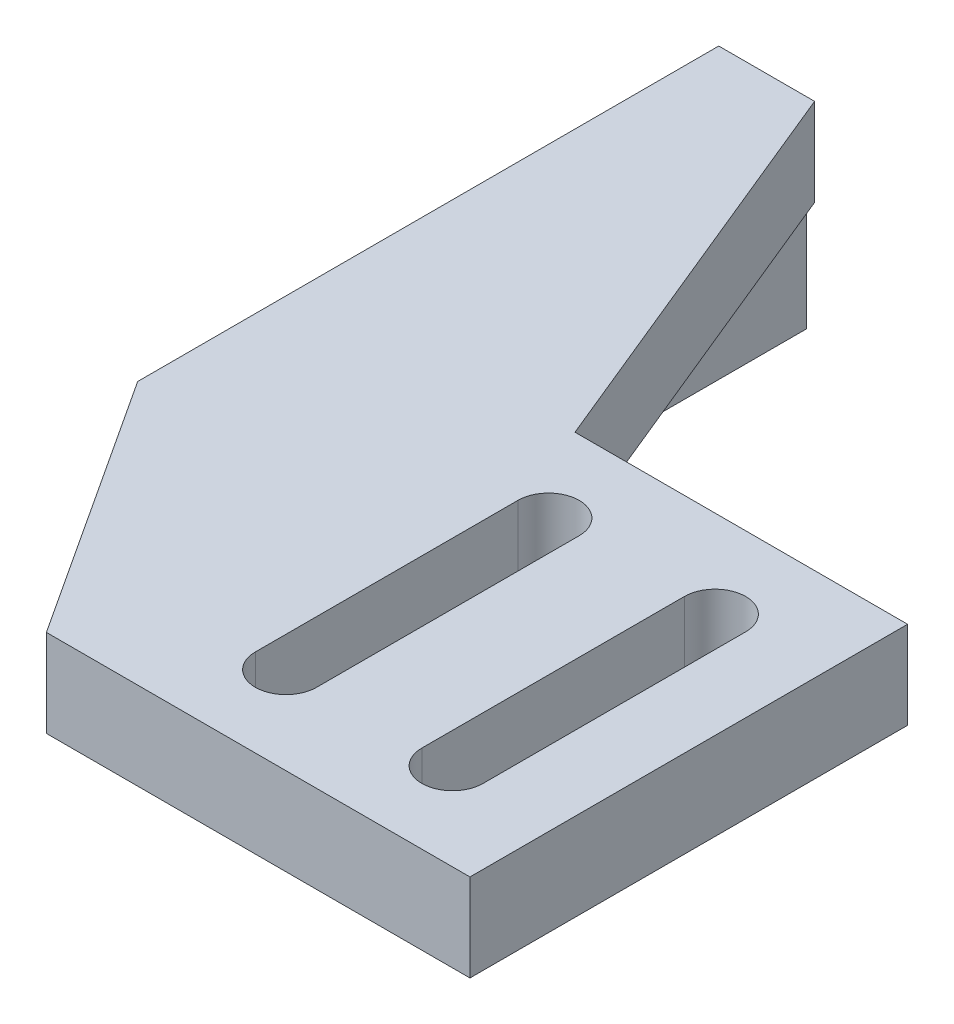
ISO-10303-21;
HEADER;
FILE_DESCRIPTION(('STEP AP214'),'2;1');
FILE_NAME('part.step','',(''),(''),'','','');
FILE_SCHEMA(('AUTOMOTIVE_DESIGN { 1 0 10303 214 1 1 1 1 }'));
ENDSEC;
DATA;
#1=APPLICATION_CONTEXT('core data for automotive mechanical design processes');
#2=APPLICATION_PROTOCOL_DEFINITION('international standard','automotive_design',2000,#1);
#3=PRODUCT_CONTEXT('',#1,'mechanical');
#4=PRODUCT('Part','Part','',(#3));
#5=PRODUCT_RELATED_PRODUCT_CATEGORY('part','',(#4));
#6=PRODUCT_DEFINITION_FORMATION('','',#4);
#7=PRODUCT_DEFINITION_CONTEXT('part definition',#1,'design');
#8=PRODUCT_DEFINITION('design','',#6,#7);
#9=PRODUCT_DEFINITION_SHAPE('','',#8);
#10=(LENGTH_UNIT() NAMED_UNIT(*) SI_UNIT(.MILLI.,.METRE.));
#11=(NAMED_UNIT(*) PLANE_ANGLE_UNIT() SI_UNIT($,.RADIAN.));
#12=(NAMED_UNIT(*) SI_UNIT($,.STERADIAN.) SOLID_ANGLE_UNIT());
#13=UNCERTAINTY_MEASURE_WITH_UNIT(LENGTH_MEASURE(1.E-05),#10,'distance_accuracy_value','');
#14=(GEOMETRIC_REPRESENTATION_CONTEXT(3) GLOBAL_UNCERTAINTY_ASSIGNED_CONTEXT((#13)) GLOBAL_UNIT_ASSIGNED_CONTEXT((#10,
#11,#12)) REPRESENTATION_CONTEXT('',''));
#15=CARTESIAN_POINT('',(0.,0.,0.));
#16=DIRECTION('',(0.,0.,1.));
#17=DIRECTION('',(1.,0.,0.));
#18=AXIS2_PLACEMENT_3D('',#15,#16,#17);
#19=CARTESIAN_POINT('',(-4.,33.5,16.));
#20=DIRECTION('',(-1.,0.,0.));
#21=DIRECTION('',(0.,0.,1.));
#22=AXIS2_PLACEMENT_3D('',#19,#20,#21);
#23=PLANE('',#22);
#24=CARTESIAN_POINT('',(-4.,36.5,-19.5));
#25=DIRECTION('',(-1.,0.,0.));
#26=DIRECTION('',(0.,0.,1.));
#27=AXIS2_PLACEMENT_3D('',#24,#25,#26);
#28=CIRCLE('',#27,1.75);
#29=CARTESIAN_POINT('',(-4.,36.5,-17.75));
#30=VERTEX_POINT('',#29);
#31=EDGE_CURVE('E175',#30,#30,#28,.T.);
#32=ORIENTED_EDGE('',*,*,#31,.T.);
#33=EDGE_LOOP('',(#32));
#34=FACE_BOUND('',#33,.T.);
#35=CARTESIAN_POINT('',(-4.,36.5,-9.5));
#36=DIRECTION('',(-1.,0.,0.));
#37=DIRECTION('',(0.,0.,1.));
#38=AXIS2_PLACEMENT_3D('',#35,#36,#37);
#39=CIRCLE('',#38,1.75);
#40=CARTESIAN_POINT('',(-4.,36.5,-7.74999999999999));
#41=VERTEX_POINT('',#40);
#42=EDGE_CURVE('E329',#41,#41,#39,.T.);
#43=ORIENTED_EDGE('',*,*,#42,.T.);
#44=EDGE_LOOP('',(#43));
#45=FACE_BOUND('',#44,.T.);
#46=DIRECTION('',(0.,1.,0.));
#47=VECTOR('',#46,1.);
#48=CARTESIAN_POINT('',(-4.,33.5,0.979024983401809));
#49=LINE('',#48,#47);
#50=CARTESIAN_POINT('',(-4.,33.5,0.979024983401809));
#51=VERTEX_POINT('',#50);
#52=CARTESIAN_POINT('',(-4.,40.,0.979024983401809));
#53=VERTEX_POINT('',#52);
#54=EDGE_CURVE('E162',#51,#53,#49,.T.);
#55=ORIENTED_EDGE('',*,*,#54,.F.);
#56=DIRECTION('',(0.,0.,1.));
#57=VECTOR('',#56,1.);
#58=CARTESIAN_POINT('',(-4.,33.5,16.));
#59=LINE('',#58,#57);
#60=CARTESIAN_POINT('',(-3.99999999999999,33.5,-32.2123511891126));
#61=VERTEX_POINT('',#60);
#62=EDGE_CURVE('E191',#61,#51,#59,.T.);
#63=ORIENTED_EDGE('',*,*,#62,.F.);
#64=DIRECTION('',(0.,1.,0.));
#65=VECTOR('',#64,1.);
#66=CARTESIAN_POINT('',(-3.99999999999999,33.5,-32.2123511891126));
#67=LINE('',#66,#65);
#68=CARTESIAN_POINT('',(-4.,40.,-32.2123511891126));
#69=VERTEX_POINT('',#68);
#70=EDGE_CURVE('E173',#61,#69,#67,.T.);
#71=ORIENTED_EDGE('',*,*,#70,.T.);
#72=DIRECTION('',(0.,0.,1.));
#73=VECTOR('',#72,1.);
#74=CARTESIAN_POINT('',(-4.,40.,16.));
#75=LINE('',#74,#73);
#76=EDGE_CURVE('E57',#69,#53,#75,.T.);
#77=ORIENTED_EDGE('',*,*,#76,.T.);
#78=EDGE_LOOP('',(#55,#63,#71,#77));
#79=FACE_BOUND('',#78,.T.);
#80=ADVANCED_FACE('F33',(#34,#45,#79),#23,.F.);
#81=CARTESIAN_POINT('',(0.,33.5,0.));
#82=DIRECTION('',(0.,-1.,0.));
#83=DIRECTION('',(0.,0.,-1.));
#84=AXIS2_PLACEMENT_3D('',#81,#82,#83);
#85=PLANE('',#84);
#86=ORIENTED_EDGE('',*,*,#62,.T.);
#87=DIRECTION('',(1.,0.,0.));
#88=VECTOR('',#87,1.);
#89=CARTESIAN_POINT('',(-4.,33.5,0.979024983401809));
#90=LINE('',#89,#88);
#91=CARTESIAN_POINT('',(-9.,33.5,0.979024983401809));
#92=VERTEX_POINT('',#91);
#93=EDGE_CURVE('E161',#92,#51,#90,.T.);
#94=ORIENTED_EDGE('',*,*,#93,.F.);
#95=DIRECTION('',(0.,0.,-1.));
#96=VECTOR('',#95,1.);
#97=CARTESIAN_POINT('',(-9.,33.5,16.));
#98=LINE('',#97,#96);
#99=CARTESIAN_POINT('',(-9.,33.5,-32.2123511891126));
#100=VERTEX_POINT('',#99);
#101=EDGE_CURVE('E174',#92,#100,#98,.T.);
#102=ORIENTED_EDGE('',*,*,#101,.T.);
#103=DIRECTION('',(1.,0.,0.));
#104=VECTOR('',#103,1.);
#105=CARTESIAN_POINT('',(-9.,33.5,-32.2123511891126));
#106=LINE('',#105,#104);
#107=EDGE_CURVE('E177',#100,#61,#106,.T.);
#108=ORIENTED_EDGE('',*,*,#107,.T.);
#109=EDGE_LOOP('',(#86,#94,#102,#108));
#110=FACE_BOUND('',#109,.T.);
#111=ADVANCED_FACE('F333',(#110),#85,.T.);
#112=CARTESIAN_POINT('',(0.805132442555695,24.,16.));
#113=DIRECTION('',(0.837384923606884,0.,-0.546613656722821));
#114=DIRECTION('',(-0.546613656722821,0.,-0.837384923606884));
#115=AXIS2_PLACEMENT_3D('',#112,#113,#114);
#116=PLANE('',#115);
#117=DIRECTION('',(0.,1.,0.));
#118=VECTOR('',#117,1.);
#119=CARTESIAN_POINT('',(-9.,24.,0.979024983401803));
#120=LINE('',#119,#118);
#121=CARTESIAN_POINT('',(-9.,40.,0.979024983401803));
#122=VERTEX_POINT('',#121);
#123=CARTESIAN_POINT('',(-9.,45.,0.979024983401803));
#124=VERTEX_POINT('',#123);
#125=EDGE_CURVE('E318',#122,#124,#120,.T.);
#126=ORIENTED_EDGE('',*,*,#125,.F.);
#127=DIRECTION('',(0.546613656722821,0.,0.837384923606884));
#128=VECTOR('',#127,1.);
#129=CARTESIAN_POINT('',(-6.759046816549,40.,4.41205375473065));
#130=LINE('',#129,#128);
#131=CARTESIAN_POINT('',(0.805132442555695,40.,16.));
#132=VERTEX_POINT('',#131);
#133=EDGE_CURVE('E51',#122,#132,#130,.T.);
#134=ORIENTED_EDGE('',*,*,#133,.T.);
#135=DIRECTION('',(0.,1.,0.));
#136=VECTOR('',#135,1.);
#137=CARTESIAN_POINT('',(0.805132442555695,24.,16.));
#138=LINE('',#137,#136);
#139=CARTESIAN_POINT('',(0.805132442555695,45.,16.));
#140=VERTEX_POINT('',#139);
#141=EDGE_CURVE('E301',#132,#140,#138,.T.);
#142=ORIENTED_EDGE('',*,*,#141,.T.);
#143=DIRECTION('',(-0.546613656722821,0.,-0.837384923606883));
#144=VECTOR('',#143,1.);
#145=CARTESIAN_POINT('',(0.805132442555695,45.,16.));
#146=LINE('',#145,#144);
#147=EDGE_CURVE('E314',#140,#124,#146,.T.);
#148=ORIENTED_EDGE('',*,*,#147,.T.);
#149=EDGE_LOOP('',(#126,#134,#142,#148));
#150=FACE_BOUND('',#149,.T.);
#151=ADVANCED_FACE('F337',(#150),#116,.F.);
#152=CARTESIAN_POINT('',(0.,45.,0.));
#153=DIRECTION('',(0.,-1.,0.));
#154=DIRECTION('',(0.,0.,-1.));
#155=AXIS2_PLACEMENT_3D('',#152,#153,#154);
#156=PLANE('',#155);
#157=CARTESIAN_POINT('',(19.,45.,11.));
#158=DIRECTION('',(0.,1.,0.));
#159=DIRECTION('',(0.,0.,1.));
#160=AXIS2_PLACEMENT_3D('',#157,#158,#159);
#161=CIRCLE('',#160,1.75);
#162=CARTESIAN_POINT('',(17.25,45.,11.));
#163=VERTEX_POINT('',#162);
#164=CARTESIAN_POINT('',(20.75,45.,11.));
#165=VERTEX_POINT('',#164);
#166=EDGE_CURVE('E225',#163,#165,#161,.T.);
#167=ORIENTED_EDGE('',*,*,#166,.F.);
#168=DIRECTION('',(0.,0.,1.));
#169=VECTOR('',#168,1.);
#170=CARTESIAN_POINT('',(17.25,45.,11.));
#171=LINE('',#170,#169);
#172=CARTESIAN_POINT('',(17.25,45.,-4.));
#173=VERTEX_POINT('',#172);
#174=EDGE_CURVE('E233',#173,#163,#171,.T.);
#175=ORIENTED_EDGE('',*,*,#174,.F.);
#176=CARTESIAN_POINT('',(19.,45.,-4.));
#177=DIRECTION('',(0.,1.,0.));
#178=DIRECTION('',(0.,0.,1.));
#179=AXIS2_PLACEMENT_3D('',#176,#177,#178);
#180=CIRCLE('',#179,1.75);
#181=CARTESIAN_POINT('',(20.75,45.,-4.));
#182=VERTEX_POINT('',#181);
#183=EDGE_CURVE('E230',#182,#173,#180,.T.);
#184=ORIENTED_EDGE('',*,*,#183,.F.);
#185=DIRECTION('',(0.,0.,-1.));
#186=VECTOR('',#185,1.);
#187=CARTESIAN_POINT('',(20.75,45.,11.));
#188=LINE('',#187,#186);
#189=EDGE_CURVE('E227',#165,#182,#188,.T.);
#190=ORIENTED_EDGE('',*,*,#189,.F.);
#191=EDGE_LOOP('',(#167,#175,#184,#190));
#192=FACE_BOUND('',#191,.T.);
#193=DIRECTION('',(0.,0.,1.));
#194=VECTOR('',#193,1.);
#195=CARTESIAN_POINT('',(-9.,45.,16.));
#196=LINE('',#195,#194);
#197=CARTESIAN_POINT('',(-9.,45.,-32.2123511891126));
#198=VERTEX_POINT('',#197);
#199=EDGE_CURVE('E264',#198,#124,#196,.T.);
#200=ORIENTED_EDGE('',*,*,#199,.T.);
#201=ORIENTED_EDGE('',*,*,#147,.F.);
#202=DIRECTION('',(1.,0.,0.));
#203=VECTOR('',#202,1.);
#204=CARTESIAN_POINT('',(25.,45.,16.));
#205=LINE('',#204,#203);
#206=CARTESIAN_POINT('',(25.,45.,16.));
#207=VERTEX_POINT('',#206);
#208=EDGE_CURVE('E267',#140,#207,#205,.T.);
#209=ORIENTED_EDGE('',*,*,#208,.T.);
#210=DIRECTION('',(0.,0.,-1.));
#211=VECTOR('',#210,1.);
#212=CARTESIAN_POINT('',(25.,45.,16.));
#213=LINE('',#212,#211);
#214=CARTESIAN_POINT('',(25.,45.,-9.00000000000001));
#215=VERTEX_POINT('',#214);
#216=EDGE_CURVE('E269',#207,#215,#213,.T.);
#217=ORIENTED_EDGE('',*,*,#216,.T.);
#218=DIRECTION('',(-1.,0.,0.));
#219=VECTOR('',#218,1.);
#220=CARTESIAN_POINT('',(25.,45.,-9.00000000000001));
#221=LINE('',#220,#219);
#222=CARTESIAN_POINT('',(6.,45.,-9.));
#223=VERTEX_POINT('',#222);
#224=EDGE_CURVE('E256',#215,#223,#221,.T.);
#225=ORIENTED_EDGE('',*,*,#224,.T.);
#226=DIRECTION('',(-0.379614820608997,0.,-0.925144630841037));
#227=VECTOR('',#226,1.);
#228=CARTESIAN_POINT('',(-3.52472968962415,45.,-32.2123511891126));
#229=LINE('',#228,#227);
#230=CARTESIAN_POINT('',(-3.52472968962415,45.,-32.2123511891126));
#231=VERTEX_POINT('',#230);
#232=EDGE_CURVE('E259',#223,#231,#229,.T.);
#233=ORIENTED_EDGE('',*,*,#232,.T.);
#234=DIRECTION('',(-1.,0.,0.));
#235=VECTOR('',#234,1.);
#236=CARTESIAN_POINT('',(-9.,45.,-32.2123511891126));
#237=LINE('',#236,#235);
#238=EDGE_CURVE('E262',#231,#198,#237,.T.);
#239=ORIENTED_EDGE('',*,*,#238,.T.);
#240=EDGE_LOOP('',(#200,#201,#209,#217,#225,#233,#239));
#241=FACE_BOUND('',#240,.T.);
#242=CARTESIAN_POINT('',(9.49056589028713,45.,11.));
#243=DIRECTION('',(0.,1.,0.));
#244=DIRECTION('',(0.,0.,1.));
#245=AXIS2_PLACEMENT_3D('',#242,#243,#244);
#246=CIRCLE('',#245,1.75);
#247=CARTESIAN_POINT('',(7.74056589028713,45.,11.));
#248=VERTEX_POINT('',#247);
#249=CARTESIAN_POINT('',(11.2405658902871,45.,11.));
#250=VERTEX_POINT('',#249);
#251=EDGE_CURVE('E193',#248,#250,#246,.T.);
#252=ORIENTED_EDGE('',*,*,#251,.F.);
#253=DIRECTION('',(0.,0.,1.));
#254=VECTOR('',#253,1.);
#255=CARTESIAN_POINT('',(7.74056589028713,45.,11.));
#256=LINE('',#255,#254);
#257=CARTESIAN_POINT('',(7.74056589028713,45.,-4.));
#258=VERTEX_POINT('',#257);
#259=EDGE_CURVE('E201',#258,#248,#256,.T.);
#260=ORIENTED_EDGE('',*,*,#259,.F.);
#261=CARTESIAN_POINT('',(9.49056589028713,45.,-4.));
#262=DIRECTION('',(0.,1.,0.));
#263=DIRECTION('',(0.,0.,1.));
#264=AXIS2_PLACEMENT_3D('',#261,#262,#263);
#265=CIRCLE('',#264,1.75);
#266=CARTESIAN_POINT('',(11.2405658902871,45.,-4.));
#267=VERTEX_POINT('',#266);
#268=EDGE_CURVE('E198',#267,#258,#265,.T.);
#269=ORIENTED_EDGE('',*,*,#268,.F.);
#270=DIRECTION('',(0.,0.,-1.));
#271=VECTOR('',#270,1.);
#272=CARTESIAN_POINT('',(11.2405658902871,45.,11.));
#273=LINE('',#272,#271);
#274=EDGE_CURVE('E195',#250,#267,#273,.T.);
#275=ORIENTED_EDGE('',*,*,#274,.F.);
#276=EDGE_LOOP('',(#252,#260,#269,#275));
#277=FACE_BOUND('',#276,.T.);
#278=ADVANCED_FACE('F310',(#192,#241,#277),#156,.F.);
#279=CARTESIAN_POINT('',(0.,40.,0.));
#280=DIRECTION('',(0.,-1.,0.));
#281=DIRECTION('',(0.,0.,-1.));
#282=AXIS2_PLACEMENT_3D('',#279,#280,#281);
#283=PLANE('',#282);
#284=ORIENTED_EDGE('',*,*,#133,.F.);
#285=DIRECTION('',(-1.,0.,0.));
#286=VECTOR('',#285,1.);
#287=CARTESIAN_POINT('',(-4.,40.,0.979024983401809));
#288=LINE('',#287,#286);
#289=EDGE_CURVE('E155',#53,#122,#288,.T.);
#290=ORIENTED_EDGE('',*,*,#289,.F.);
#291=ORIENTED_EDGE('',*,*,#76,.F.);
#292=DIRECTION('',(-1.,0.,0.));
#293=VECTOR('',#292,1.);
#294=CARTESIAN_POINT('',(-9.,40.,-32.2123511891126));
#295=LINE('',#294,#293);
#296=CARTESIAN_POINT('',(-3.52472968962415,40.,-32.2123511891126));
#297=VERTEX_POINT('',#296);
#298=EDGE_CURVE('E185',#297,#69,#295,.T.);
#299=ORIENTED_EDGE('',*,*,#298,.F.);
#300=DIRECTION('',(-0.379614820608997,0.,-0.925144630841037));
#301=VECTOR('',#300,1.);
#302=CARTESIAN_POINT('',(-3.52472968962415,40.,-32.2123511891126));
#303=LINE('',#302,#301);
#304=CARTESIAN_POINT('',(6.,40.,-9.));
#305=VERTEX_POINT('',#304);
#306=EDGE_CURVE('E274',#305,#297,#303,.T.);
#307=ORIENTED_EDGE('',*,*,#306,.F.);
#308=DIRECTION('',(-1.,0.,0.));
#309=VECTOR('',#308,1.);
#310=CARTESIAN_POINT('',(25.,40.,-9.00000000000001));
#311=LINE('',#310,#309);
#312=CARTESIAN_POINT('',(25.,40.,-9.00000000000001));
#313=VERTEX_POINT('',#312);
#314=EDGE_CURVE('E255',#313,#305,#311,.T.);
#315=ORIENTED_EDGE('',*,*,#314,.F.);
#316=DIRECTION('',(0.,0.,-1.));
#317=VECTOR('',#316,1.);
#318=CARTESIAN_POINT('',(25.,40.,16.));
#319=LINE('',#318,#317);
#320=CARTESIAN_POINT('',(25.,40.,16.));
#321=VERTEX_POINT('',#320);
#322=EDGE_CURVE('E260',#321,#313,#319,.T.);
#323=ORIENTED_EDGE('',*,*,#322,.F.);
#324=DIRECTION('',(1.,0.,0.));
#325=VECTOR('',#324,1.);
#326=CARTESIAN_POINT('',(25.,40.,16.));
#327=LINE('',#326,#325);
#328=EDGE_CURVE('E37',#132,#321,#327,.T.);
#329=ORIENTED_EDGE('',*,*,#328,.F.);
#330=EDGE_LOOP('',(#284,#290,#291,#299,#307,#315,#323,#329));
#331=FACE_BOUND('',#330,.T.);
#332=DIRECTION('',(0.,0.,1.));
#333=VECTOR('',#332,1.);
#334=CARTESIAN_POINT('',(17.25,40.,11.));
#335=LINE('',#334,#333);
#336=CARTESIAN_POINT('',(17.25,40.,-4.));
#337=VERTEX_POINT('',#336);
#338=CARTESIAN_POINT('',(17.25,40.,11.));
#339=VERTEX_POINT('',#338);
#340=EDGE_CURVE('E228',#337,#339,#335,.T.);
#341=ORIENTED_EDGE('',*,*,#340,.T.);
#342=CARTESIAN_POINT('',(19.,40.,11.));
#343=DIRECTION('',(0.,1.,0.));
#344=DIRECTION('',(0.,0.,1.));
#345=AXIS2_PLACEMENT_3D('',#342,#343,#344);
#346=CIRCLE('',#345,1.75);
#347=CARTESIAN_POINT('',(20.75,40.,11.));
#348=VERTEX_POINT('',#347);
#349=EDGE_CURVE('E224',#339,#348,#346,.T.);
#350=ORIENTED_EDGE('',*,*,#349,.T.);
#351=DIRECTION('',(0.,0.,-1.));
#352=VECTOR('',#351,1.);
#353=CARTESIAN_POINT('',(20.75,40.,11.));
#354=LINE('',#353,#352);
#355=CARTESIAN_POINT('',(20.75,40.,-4.));
#356=VERTEX_POINT('',#355);
#357=EDGE_CURVE('E238',#348,#356,#354,.T.);
#358=ORIENTED_EDGE('',*,*,#357,.T.);
#359=CARTESIAN_POINT('',(19.,40.,-4.));
#360=DIRECTION('',(0.,1.,0.));
#361=DIRECTION('',(0.,0.,1.));
#362=AXIS2_PLACEMENT_3D('',#359,#360,#361);
#363=CIRCLE('',#362,1.75);
#364=EDGE_CURVE('E241',#356,#337,#363,.T.);
#365=ORIENTED_EDGE('',*,*,#364,.T.);
#366=EDGE_LOOP('',(#341,#350,#358,#365));
#367=FACE_BOUND('',#366,.T.);
#368=DIRECTION('',(0.,0.,1.));
#369=VECTOR('',#368,1.);
#370=CARTESIAN_POINT('',(7.74056589028713,40.,11.));
#371=LINE('',#370,#369);
#372=CARTESIAN_POINT('',(7.74056589028713,40.,-4.));
#373=VERTEX_POINT('',#372);
#374=CARTESIAN_POINT('',(7.74056589028713,40.,11.));
#375=VERTEX_POINT('',#374);
#376=EDGE_CURVE('E196',#373,#375,#371,.T.);
#377=ORIENTED_EDGE('',*,*,#376,.T.);
#378=CARTESIAN_POINT('',(9.49056589028713,40.,11.));
#379=DIRECTION('',(0.,1.,0.));
#380=DIRECTION('',(0.,0.,1.));
#381=AXIS2_PLACEMENT_3D('',#378,#379,#380);
#382=CIRCLE('',#381,1.75);
#383=CARTESIAN_POINT('',(11.2405658902871,40.,11.));
#384=VERTEX_POINT('',#383);
#385=EDGE_CURVE('E204',#375,#384,#382,.T.);
#386=ORIENTED_EDGE('',*,*,#385,.T.);
#387=DIRECTION('',(0.,0.,-1.));
#388=VECTOR('',#387,1.);
#389=CARTESIAN_POINT('',(11.2405658902871,40.,11.));
#390=LINE('',#389,#388);
#391=CARTESIAN_POINT('',(11.2405658902871,40.,-4.));
#392=VERTEX_POINT('',#391);
#393=EDGE_CURVE('E207',#384,#392,#390,.T.);
#394=ORIENTED_EDGE('',*,*,#393,.T.);
#395=CARTESIAN_POINT('',(9.49056589028713,40.,-4.));
#396=DIRECTION('',(0.,1.,0.));
#397=DIRECTION('',(0.,0.,1.));
#398=AXIS2_PLACEMENT_3D('',#395,#396,#397);
#399=CIRCLE('',#398,1.75);
#400=EDGE_CURVE('E210',#392,#373,#399,.T.);
#401=ORIENTED_EDGE('',*,*,#400,.T.);
#402=EDGE_LOOP('',(#377,#386,#394,#401));
#403=FACE_BOUND('',#402,.T.);
#404=ADVANCED_FACE('F157',(#331,#367,#403),#283,.T.);
#405=CARTESIAN_POINT('',(25.,45.,-9.00000000000001));
#406=DIRECTION('',(0.,0.,1.));
#407=DIRECTION('',(1.,0.,0.));
#408=AXIS2_PLACEMENT_3D('',#405,#406,#407);
#409=PLANE('',#408);
#410=ORIENTED_EDGE('',*,*,#314,.T.);
#411=DIRECTION('',(0.,-1.,0.));
#412=VECTOR('',#411,1.);
#413=CARTESIAN_POINT('',(6.,45.,-9.));
#414=LINE('',#413,#412);
#415=EDGE_CURVE('E11',#223,#305,#414,.T.);
#416=ORIENTED_EDGE('',*,*,#415,.F.);
#417=ORIENTED_EDGE('',*,*,#224,.F.);
#418=DIRECTION('',(0.,-1.,0.));
#419=VECTOR('',#418,1.);
#420=CARTESIAN_POINT('',(25.,45.,-9.00000000000001));
#421=LINE('',#420,#419);
#422=EDGE_CURVE('E271',#215,#313,#421,.T.);
#423=ORIENTED_EDGE('',*,*,#422,.T.);
#424=EDGE_LOOP('',(#410,#416,#417,#423));
#425=FACE_BOUND('',#424,.T.);
#426=ADVANCED_FACE('F35',(#425),#409,.F.);
#427=CARTESIAN_POINT('',(-3.52472968962415,45.,-32.2123511891126));
#428=DIRECTION('',(-0.925144630841037,0.,0.379614820608997));
#429=DIRECTION('',(0.379614820608997,0.,0.925144630841037));
#430=AXIS2_PLACEMENT_3D('',#427,#428,#429);
#431=PLANE('',#430);
#432=ORIENTED_EDGE('',*,*,#306,.T.);
#433=DIRECTION('',(0.,-1.,0.));
#434=VECTOR('',#433,1.);
#435=CARTESIAN_POINT('',(-3.52472968962415,45.,-32.2123511891126));
#436=LINE('',#435,#434);
#437=EDGE_CURVE('E43',#231,#297,#436,.T.);
#438=ORIENTED_EDGE('',*,*,#437,.F.);
#439=ORIENTED_EDGE('',*,*,#232,.F.);
#440=ORIENTED_EDGE('',*,*,#415,.T.);
#441=EDGE_LOOP('',(#432,#438,#439,#440));
#442=FACE_BOUND('',#441,.T.);
#443=ADVANCED_FACE('F400',(#442),#431,.F.);
#444=CARTESIAN_POINT('',(-9.,45.,-32.2123511891126));
#445=DIRECTION('',(0.,0.,1.));
#446=DIRECTION('',(1.,0.,0.));
#447=AXIS2_PLACEMENT_3D('',#444,#445,#446);
#448=PLANE('',#447);
#449=ORIENTED_EDGE('',*,*,#298,.T.);
#450=ORIENTED_EDGE('',*,*,#70,.F.);
#451=ORIENTED_EDGE('',*,*,#107,.F.);
#452=DIRECTION('',(0.,-1.,0.));
#453=VECTOR('',#452,1.);
#454=CARTESIAN_POINT('',(-9.,45.,-32.2123511891126));
#455=LINE('',#454,#453);
#456=EDGE_CURVE('E284',#198,#100,#455,.T.);
#457=ORIENTED_EDGE('',*,*,#456,.F.);
#458=ORIENTED_EDGE('',*,*,#238,.F.);
#459=ORIENTED_EDGE('',*,*,#437,.T.);
#460=EDGE_LOOP('',(#449,#450,#451,#457,#458,#459));
#461=FACE_BOUND('',#460,.T.);
#462=ADVANCED_FACE('F291',(#461),#448,.F.);
#463=CARTESIAN_POINT('',(-9.,45.,16.));
#464=DIRECTION('',(1.,0.,0.));
#465=DIRECTION('',(0.,0.,-1.));
#466=AXIS2_PLACEMENT_3D('',#463,#464,#465);
#467=PLANE('',#466);
#468=CARTESIAN_POINT('',(-9.,36.5,-9.5));
#469=DIRECTION('',(-1.,0.,0.));
#470=DIRECTION('',(0.,0.,-1.));
#471=AXIS2_PLACEMENT_3D('',#468,#469,#470);
#472=CIRCLE('',#471,1.75);
#473=CARTESIAN_POINT('',(-9.,36.5,-11.25));
#474=VERTEX_POINT('',#473);
#475=EDGE_CURVE('E326',#474,#474,#472,.T.);
#476=ORIENTED_EDGE('',*,*,#475,.F.);
#477=EDGE_LOOP('',(#476));
#478=FACE_BOUND('',#477,.T.);
#479=CARTESIAN_POINT('',(-9.,36.5,-19.5));
#480=DIRECTION('',(-1.,0.,0.));
#481=DIRECTION('',(0.,0.,1.));
#482=AXIS2_PLACEMENT_3D('',#479,#480,#481);
#483=CIRCLE('',#482,1.75);
#484=CARTESIAN_POINT('',(-9.,36.5,-17.75));
#485=VERTEX_POINT('',#484);
#486=EDGE_CURVE('E180',#485,#485,#483,.T.);
#487=ORIENTED_EDGE('',*,*,#486,.F.);
#488=EDGE_LOOP('',(#487));
#489=FACE_BOUND('',#488,.T.);
#490=ORIENTED_EDGE('',*,*,#101,.F.);
#491=EDGE_CURVE('E322',#92,#122,#120,.T.);
#492=ORIENTED_EDGE('',*,*,#491,.T.);
#493=ORIENTED_EDGE('',*,*,#125,.T.);
#494=ORIENTED_EDGE('',*,*,#199,.F.);
#495=ORIENTED_EDGE('',*,*,#456,.T.);
#496=EDGE_LOOP('',(#490,#492,#493,#494,#495));
#497=FACE_BOUND('',#496,.T.);
#498=ADVANCED_FACE('F336',(#478,#489,#497),#467,.F.);
#499=CARTESIAN_POINT('',(25.,45.,16.));
#500=DIRECTION('',(0.,0.,-1.));
#501=DIRECTION('',(-1.,0.,0.));
#502=AXIS2_PLACEMENT_3D('',#499,#500,#501);
#503=PLANE('',#502);
#504=ORIENTED_EDGE('',*,*,#208,.F.);
#505=ORIENTED_EDGE('',*,*,#141,.F.);
#506=ORIENTED_EDGE('',*,*,#328,.T.);
#507=DIRECTION('',(0.,-1.,0.));
#508=VECTOR('',#507,1.);
#509=CARTESIAN_POINT('',(25.,45.,16.));
#510=LINE('',#509,#508);
#511=EDGE_CURVE('E281',#207,#321,#510,.T.);
#512=ORIENTED_EDGE('',*,*,#511,.F.);
#513=EDGE_LOOP('',(#504,#505,#506,#512));
#514=FACE_BOUND('',#513,.T.);
#515=ADVANCED_FACE('F299',(#514),#503,.F.);
#516=CARTESIAN_POINT('',(25.,45.,16.));
#517=DIRECTION('',(-1.,0.,0.));
#518=DIRECTION('',(0.,0.,1.));
#519=AXIS2_PLACEMENT_3D('',#516,#517,#518);
#520=PLANE('',#519);
#521=ORIENTED_EDGE('',*,*,#322,.T.);
#522=ORIENTED_EDGE('',*,*,#422,.F.);
#523=ORIENTED_EDGE('',*,*,#216,.F.);
#524=ORIENTED_EDGE('',*,*,#511,.T.);
#525=EDGE_LOOP('',(#521,#522,#523,#524));
#526=FACE_BOUND('',#525,.T.);
#527=ADVANCED_FACE('F304',(#526),#520,.F.);
#528=CARTESIAN_POINT('',(19.,45.,11.));
#529=DIRECTION('',(0.,-1.,0.));
#530=DIRECTION('',(0.,0.,-1.));
#531=AXIS2_PLACEMENT_3D('',#528,#529,#530);
#532=CYLINDRICAL_SURFACE('',#531,1.75);
#533=ORIENTED_EDGE('',*,*,#349,.F.);
#534=DIRECTION('',(0.,-1.,0.));
#535=VECTOR('',#534,1.);
#536=CARTESIAN_POINT('',(17.25,45.,11.));
#537=LINE('',#536,#535);
#538=EDGE_CURVE('E235',#163,#339,#537,.T.);
#539=ORIENTED_EDGE('',*,*,#538,.F.);
#540=ORIENTED_EDGE('',*,*,#166,.T.);
#541=DIRECTION('',(0.,-1.,0.));
#542=VECTOR('',#541,1.);
#543=CARTESIAN_POINT('',(20.75,45.,11.));
#544=LINE('',#543,#542);
#545=EDGE_CURVE('E252',#165,#348,#544,.T.);
#546=ORIENTED_EDGE('',*,*,#545,.T.);
#547=EDGE_LOOP('',(#533,#539,#540,#546));
#548=FACE_BOUND('',#547,.T.);
#549=ADVANCED_FACE('F385',(#548),#532,.F.);
#550=CARTESIAN_POINT('',(20.75,45.,11.));
#551=DIRECTION('',(-1.,0.,0.));
#552=DIRECTION('',(0.,0.,1.));
#553=AXIS2_PLACEMENT_3D('',#550,#551,#552);
#554=PLANE('',#553);
#555=ORIENTED_EDGE('',*,*,#357,.F.);
#556=ORIENTED_EDGE('',*,*,#545,.F.);
#557=ORIENTED_EDGE('',*,*,#189,.T.);
#558=DIRECTION('',(0.,-1.,0.));
#559=VECTOR('',#558,1.);
#560=CARTESIAN_POINT('',(20.75,45.,-4.));
#561=LINE('',#560,#559);
#562=EDGE_CURVE('E250',#182,#356,#561,.T.);
#563=ORIENTED_EDGE('',*,*,#562,.T.);
#564=EDGE_LOOP('',(#555,#556,#557,#563));
#565=FACE_BOUND('',#564,.T.);
#566=ADVANCED_FACE('F381',(#565),#554,.T.);
#567=CARTESIAN_POINT('',(19.,45.,-4.));
#568=DIRECTION('',(0.,-1.,0.));
#569=DIRECTION('',(0.,0.,-1.));
#570=AXIS2_PLACEMENT_3D('',#567,#568,#569);
#571=CYLINDRICAL_SURFACE('',#570,1.75);
#572=ORIENTED_EDGE('',*,*,#364,.F.);
#573=ORIENTED_EDGE('',*,*,#562,.F.);
#574=ORIENTED_EDGE('',*,*,#183,.T.);
#575=DIRECTION('',(0.,-1.,0.));
#576=VECTOR('',#575,1.);
#577=CARTESIAN_POINT('',(17.25,45.,-4.));
#578=LINE('',#577,#576);
#579=EDGE_CURVE('E248',#173,#337,#578,.T.);
#580=ORIENTED_EDGE('',*,*,#579,.T.);
#581=EDGE_LOOP('',(#572,#573,#574,#580));
#582=FACE_BOUND('',#581,.T.);
#583=ADVANCED_FACE('F377',(#582),#571,.F.);
#584=CARTESIAN_POINT('',(17.25,45.,11.));
#585=DIRECTION('',(1.,0.,0.));
#586=DIRECTION('',(0.,0.,-1.));
#587=AXIS2_PLACEMENT_3D('',#584,#585,#586);
#588=PLANE('',#587);
#589=ORIENTED_EDGE('',*,*,#340,.F.);
#590=ORIENTED_EDGE('',*,*,#579,.F.);
#591=ORIENTED_EDGE('',*,*,#174,.T.);
#592=ORIENTED_EDGE('',*,*,#538,.T.);
#593=EDGE_LOOP('',(#589,#590,#591,#592));
#594=FACE_BOUND('',#593,.T.);
#595=ADVANCED_FACE('F373',(#594),#588,.T.);
#596=CARTESIAN_POINT('',(9.49056589028713,45.,11.));
#597=DIRECTION('',(0.,-1.,0.));
#598=DIRECTION('',(0.,0.,-1.));
#599=AXIS2_PLACEMENT_3D('',#596,#597,#598);
#600=CYLINDRICAL_SURFACE('',#599,1.75);
#601=ORIENTED_EDGE('',*,*,#385,.F.);
#602=DIRECTION('',(0.,-1.,0.));
#603=VECTOR('',#602,1.);
#604=CARTESIAN_POINT('',(7.74056589028713,45.,11.));
#605=LINE('',#604,#603);
#606=EDGE_CURVE('E203',#248,#375,#605,.T.);
#607=ORIENTED_EDGE('',*,*,#606,.F.);
#608=ORIENTED_EDGE('',*,*,#251,.T.);
#609=DIRECTION('',(0.,-1.,0.));
#610=VECTOR('',#609,1.);
#611=CARTESIAN_POINT('',(11.2405658902871,45.,11.));
#612=LINE('',#611,#610);
#613=EDGE_CURVE('E221',#250,#384,#612,.T.);
#614=ORIENTED_EDGE('',*,*,#613,.T.);
#615=EDGE_LOOP('',(#601,#607,#608,#614));
#616=FACE_BOUND('',#615,.T.);
#617=ADVANCED_FACE('F369',(#616),#600,.F.);
#618=CARTESIAN_POINT('',(11.2405658902871,45.,11.));
#619=DIRECTION('',(-1.,0.,0.));
#620=DIRECTION('',(0.,0.,1.));
#621=AXIS2_PLACEMENT_3D('',#618,#619,#620);
#622=PLANE('',#621);
#623=ORIENTED_EDGE('',*,*,#393,.F.);
#624=ORIENTED_EDGE('',*,*,#613,.F.);
#625=ORIENTED_EDGE('',*,*,#274,.T.);
#626=DIRECTION('',(0.,-1.,0.));
#627=VECTOR('',#626,1.);
#628=CARTESIAN_POINT('',(11.2405658902871,45.,-4.));
#629=LINE('',#628,#627);
#630=EDGE_CURVE('E219',#267,#392,#629,.T.);
#631=ORIENTED_EDGE('',*,*,#630,.T.);
#632=EDGE_LOOP('',(#623,#624,#625,#631));
#633=FACE_BOUND('',#632,.T.);
#634=ADVANCED_FACE('F365',(#633),#622,.T.);
#635=CARTESIAN_POINT('',(9.49056589028713,45.,-4.));
#636=DIRECTION('',(0.,-1.,0.));
#637=DIRECTION('',(0.,0.,-1.));
#638=AXIS2_PLACEMENT_3D('',#635,#636,#637);
#639=CYLINDRICAL_SURFACE('',#638,1.75);
#640=ORIENTED_EDGE('',*,*,#400,.F.);
#641=ORIENTED_EDGE('',*,*,#630,.F.);
#642=ORIENTED_EDGE('',*,*,#268,.T.);
#643=DIRECTION('',(0.,-1.,0.));
#644=VECTOR('',#643,1.);
#645=CARTESIAN_POINT('',(7.74056589028713,45.,-4.));
#646=LINE('',#645,#644);
#647=EDGE_CURVE('E217',#258,#373,#646,.T.);
#648=ORIENTED_EDGE('',*,*,#647,.T.);
#649=EDGE_LOOP('',(#640,#641,#642,#648));
#650=FACE_BOUND('',#649,.T.);
#651=ADVANCED_FACE('F361',(#650),#639,.F.);
#652=CARTESIAN_POINT('',(7.74056589028713,45.,11.));
#653=DIRECTION('',(1.,0.,0.));
#654=DIRECTION('',(0.,0.,-1.));
#655=AXIS2_PLACEMENT_3D('',#652,#653,#654);
#656=PLANE('',#655);
#657=ORIENTED_EDGE('',*,*,#376,.F.);
#658=ORIENTED_EDGE('',*,*,#647,.F.);
#659=ORIENTED_EDGE('',*,*,#259,.T.);
#660=ORIENTED_EDGE('',*,*,#606,.T.);
#661=EDGE_LOOP('',(#657,#658,#659,#660));
#662=FACE_BOUND('',#661,.T.);
#663=ADVANCED_FACE('F357',(#662),#656,.T.);
#664=CARTESIAN_POINT('',(-3.,36.5,-19.5));
#665=DIRECTION('',(-1.,0.,0.));
#666=DIRECTION('',(0.,0.,1.));
#667=AXIS2_PLACEMENT_3D('',#664,#665,#666);
#668=CYLINDRICAL_SURFACE('',#667,1.75);
#669=ORIENTED_EDGE('',*,*,#486,.T.);
#670=EDGE_LOOP('',(#669));
#671=FACE_BOUND('',#670,.T.);
#672=ORIENTED_EDGE('',*,*,#31,.F.);
#673=EDGE_LOOP('',(#672));
#674=FACE_BOUND('',#673,.T.);
#675=ADVANCED_FACE('F360',(#671,#674),#668,.F.);
#676=CARTESIAN_POINT('',(-3.,36.5,-9.5));
#677=DIRECTION('',(-1.,0.,0.));
#678=DIRECTION('',(0.,0.,1.));
#679=AXIS2_PLACEMENT_3D('',#676,#677,#678);
#680=CYLINDRICAL_SURFACE('',#679,1.75);
#681=ORIENTED_EDGE('',*,*,#475,.T.);
#682=EDGE_LOOP('',(#681));
#683=FACE_BOUND('',#682,.T.);
#684=ORIENTED_EDGE('',*,*,#42,.F.);
#685=EDGE_LOOP('',(#684));
#686=FACE_BOUND('',#685,.T.);
#687=ADVANCED_FACE('F423',(#683,#686),#680,.F.);
#688=CARTESIAN_POINT('',(0.,0.,0.979024983401809));
#689=DIRECTION('',(0.,0.,1.));
#690=DIRECTION('',(1.,0.,0.));
#691=AXIS2_PLACEMENT_3D('',#688,#689,#690);
#692=PLANE('',#691);
#693=ORIENTED_EDGE('',*,*,#54,.T.);
#694=ORIENTED_EDGE('',*,*,#289,.T.);
#695=ORIENTED_EDGE('',*,*,#491,.F.);
#696=ORIENTED_EDGE('',*,*,#93,.T.);
#697=EDGE_LOOP('',(#693,#694,#695,#696));
#698=FACE_BOUND('',#697,.T.);
#699=ADVANCED_FACE('F165',(#698),#692,.T.);
#700=CLOSED_SHELL('',(#80,#111,#151,#278,#404,#426,#443,#462,#498,#515,#527,#549,#566,#583,#595,
#617,#634,#651,#663,#675,#687,#699));
#701=MANIFOLD_SOLID_BREP('B2',#700);
#702=ADVANCED_BREP_SHAPE_REPRESENTATION('',(#18,#701),#14);
#703=SHAPE_DEFINITION_REPRESENTATION(#9,#702);
ENDSEC;
END-ISO-10303-21;
